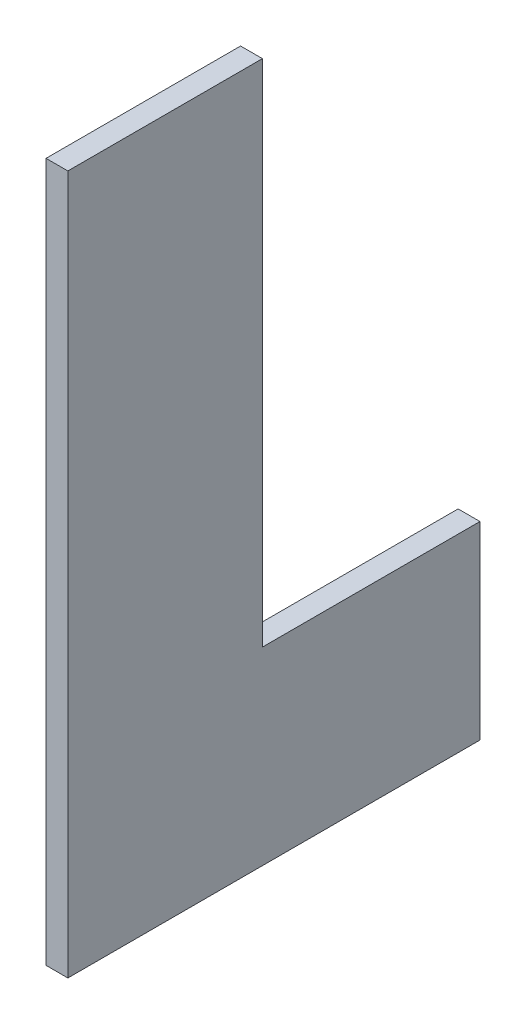
ISO-10303-21;
HEADER;
FILE_DESCRIPTION(('STEP AP214'),'2;1');
FILE_NAME('part.step','',(''),(''),'','','');
FILE_SCHEMA(('AUTOMOTIVE_DESIGN { 1 0 10303 214 1 1 1 1 }'));
ENDSEC;
DATA;
#1=APPLICATION_CONTEXT('core data for automotive mechanical design processes');
#2=APPLICATION_PROTOCOL_DEFINITION('international standard','automotive_design',2000,#1);
#3=PRODUCT_CONTEXT('',#1,'mechanical');
#4=PRODUCT('Part','Part','',(#3));
#5=PRODUCT_RELATED_PRODUCT_CATEGORY('part','',(#4));
#6=PRODUCT_DEFINITION_FORMATION('','',#4);
#7=PRODUCT_DEFINITION_CONTEXT('part definition',#1,'design');
#8=PRODUCT_DEFINITION('design','',#6,#7);
#9=PRODUCT_DEFINITION_SHAPE('','',#8);
#10=(LENGTH_UNIT() NAMED_UNIT(*) SI_UNIT(.MILLI.,.METRE.));
#11=(NAMED_UNIT(*) PLANE_ANGLE_UNIT() SI_UNIT($,.RADIAN.));
#12=(NAMED_UNIT(*) SI_UNIT($,.STERADIAN.) SOLID_ANGLE_UNIT());
#13=UNCERTAINTY_MEASURE_WITH_UNIT(LENGTH_MEASURE(1.E-05),#10,'distance_accuracy_value','');
#14=(GEOMETRIC_REPRESENTATION_CONTEXT(3) GLOBAL_UNCERTAINTY_ASSIGNED_CONTEXT((#13)) GLOBAL_UNIT_ASSIGNED_CONTEXT((#10,
#11,#12)) REPRESENTATION_CONTEXT('',''));
#15=CARTESIAN_POINT('',(0.,0.,0.));
#16=DIRECTION('',(0.,0.,1.));
#17=DIRECTION('',(1.,0.,0.));
#18=AXIS2_PLACEMENT_3D('',#15,#16,#17);
#19=CARTESIAN_POINT('',(19.05,-525.352237324474,-102.705829668172));
#20=DIRECTION('',(0.,1.,0.));
#21=DIRECTION('',(0.,0.,1.));
#22=AXIS2_PLACEMENT_3D('',#19,#20,#21);
#23=PLANE('',#22);
#24=DIRECTION('',(0.,0.,-1.));
#25=VECTOR('',#24,1.);
#26=CARTESIAN_POINT('',(0.,-525.352237324474,-102.705829668172));
#27=LINE('',#26,#25);
#28=CARTESIAN_POINT('',(0.,-525.352237324474,66.966170331828));
#29=VERTEX_POINT('',#28);
#30=CARTESIAN_POINT('',(0.,-525.352237324474,-292.443829668172));
#31=VERTEX_POINT('',#30);
#32=EDGE_CURVE('E86',#29,#31,#27,.T.);
#33=ORIENTED_EDGE('',*,*,#32,.T.);
#34=DIRECTION('',(-1.,0.,0.));
#35=VECTOR('',#34,1.);
#36=CARTESIAN_POINT('',(19.05,-525.352237324474,-292.443829668172));
#37=LINE('',#36,#35);
#38=CARTESIAN_POINT('',(19.05,-525.352237324474,-292.443829668172));
#39=VERTEX_POINT('',#38);
#40=EDGE_CURVE('E11',#39,#31,#37,.T.);
#41=ORIENTED_EDGE('',*,*,#40,.F.);
#42=DIRECTION('',(0.,0.,-1.));
#43=VECTOR('',#42,1.);
#44=CARTESIAN_POINT('',(19.05,-525.352237324474,66.966170331828));
#45=LINE('',#44,#43);
#46=CARTESIAN_POINT('',(19.05,-525.352237324474,66.966170331828));
#47=VERTEX_POINT('',#46);
#48=EDGE_CURVE('E92',#47,#39,#45,.T.);
#49=ORIENTED_EDGE('',*,*,#48,.F.);
#50=DIRECTION('',(-1.,0.,0.));
#51=VECTOR('',#50,1.);
#52=CARTESIAN_POINT('',(19.05,-525.352237324474,66.966170331828));
#53=LINE('',#52,#51);
#54=EDGE_CURVE('E124',#47,#29,#53,.T.);
#55=ORIENTED_EDGE('',*,*,#54,.T.);
#56=EDGE_LOOP('',(#33,#41,#49,#55));
#57=FACE_BOUND('',#56,.T.);
#58=ADVANCED_FACE('F39',(#57),#23,.F.);
#59=CARTESIAN_POINT('',(19.05,-525.352237324474,-292.443829668172));
#60=DIRECTION('',(0.,0.,1.));
#61=DIRECTION('',(0.,-1.,0.));
#62=AXIS2_PLACEMENT_3D('',#59,#60,#61);
#63=PLANE('',#62);
#64=DIRECTION('',(0.,1.,0.));
#65=VECTOR('',#64,1.);
#66=CARTESIAN_POINT('',(0.,-525.352237324474,-292.443829668172));
#67=LINE('',#66,#65);
#68=CARTESIAN_POINT('',(0.,-360.252237324474,-292.443829668172));
#69=VERTEX_POINT('',#68);
#70=EDGE_CURVE('E130',#31,#69,#67,.T.);
#71=ORIENTED_EDGE('',*,*,#70,.T.);
#72=DIRECTION('',(-1.,0.,0.));
#73=VECTOR('',#72,1.);
#74=CARTESIAN_POINT('',(19.05,-360.252237324474,-292.443829668172));
#75=LINE('',#74,#73);
#76=CARTESIAN_POINT('',(19.05,-360.252237324474,-292.443829668172));
#77=VERTEX_POINT('',#76);
#78=EDGE_CURVE('E48',#77,#69,#75,.T.);
#79=ORIENTED_EDGE('',*,*,#78,.F.);
#80=DIRECTION('',(0.,1.,0.));
#81=VECTOR('',#80,1.);
#82=CARTESIAN_POINT('',(19.05,-525.352237324474,-292.443829668172));
#83=LINE('',#82,#81);
#84=EDGE_CURVE('E162',#39,#77,#83,.T.);
#85=ORIENTED_EDGE('',*,*,#84,.F.);
#86=ORIENTED_EDGE('',*,*,#40,.T.);
#87=EDGE_LOOP('',(#71,#79,#85,#86));
#88=FACE_BOUND('',#87,.T.);
#89=ADVANCED_FACE('F167',(#88),#63,.F.);
#90=CARTESIAN_POINT('',(19.05,-360.252237324474,-292.443829668172));
#91=DIRECTION('',(0.,-1.,0.));
#92=DIRECTION('',(0.,0.,-1.));
#93=AXIS2_PLACEMENT_3D('',#90,#91,#92);
#94=PLANE('',#93);
#95=DIRECTION('',(0.,0.,1.));
#96=VECTOR('',#95,1.);
#97=CARTESIAN_POINT('',(0.,-360.252237324474,-292.443829668172));
#98=LINE('',#97,#96);
#99=CARTESIAN_POINT('',(0.,-360.252237324474,-102.705829668172));
#100=VERTEX_POINT('',#99);
#101=EDGE_CURVE('E133',#69,#100,#98,.T.);
#102=ORIENTED_EDGE('',*,*,#101,.T.);
#103=DIRECTION('',(-1.,0.,0.));
#104=VECTOR('',#103,1.);
#105=CARTESIAN_POINT('',(19.05,-360.252237324474,-102.705829668172));
#106=LINE('',#105,#104);
#107=CARTESIAN_POINT('',(19.05,-360.252237324474,-102.705829668172));
#108=VERTEX_POINT('',#107);
#109=EDGE_CURVE('E117',#108,#100,#106,.T.);
#110=ORIENTED_EDGE('',*,*,#109,.F.);
#111=DIRECTION('',(0.,0.,1.));
#112=VECTOR('',#111,1.);
#113=CARTESIAN_POINT('',(19.05,-360.252237324474,-292.443829668172));
#114=LINE('',#113,#112);
#115=EDGE_CURVE('E106',#77,#108,#114,.T.);
#116=ORIENTED_EDGE('',*,*,#115,.F.);
#117=ORIENTED_EDGE('',*,*,#78,.T.);
#118=EDGE_LOOP('',(#102,#110,#116,#117));
#119=FACE_BOUND('',#118,.T.);
#120=ADVANCED_FACE('F154',(#119),#94,.F.);
#121=CARTESIAN_POINT('',(19.05,-360.252237324474,-102.705829668172));
#122=DIRECTION('',(0.,0.,1.));
#123=DIRECTION('',(1.,0.,0.));
#124=AXIS2_PLACEMENT_3D('',#121,#122,#123);
#125=PLANE('',#124);
#126=DIRECTION('',(0.,1.,0.));
#127=VECTOR('',#126,1.);
#128=CARTESIAN_POINT('',(0.,-360.252237324474,-102.705829668172));
#129=LINE('',#128,#127);
#130=CARTESIAN_POINT('',(0.,84.2477626755256,-102.705829668172));
#131=VERTEX_POINT('',#130);
#132=EDGE_CURVE('E115',#100,#131,#129,.T.);
#133=ORIENTED_EDGE('',*,*,#132,.T.);
#134=DIRECTION('',(-1.,0.,0.));
#135=VECTOR('',#134,1.);
#136=CARTESIAN_POINT('',(19.05,84.2477626755256,-102.705829668172));
#137=LINE('',#136,#135);
#138=CARTESIAN_POINT('',(19.05,84.2477626755256,-102.705829668172));
#139=VERTEX_POINT('',#138);
#140=EDGE_CURVE('E112',#139,#131,#137,.T.);
#141=ORIENTED_EDGE('',*,*,#140,.F.);
#142=DIRECTION('',(0.,1.,0.));
#143=VECTOR('',#142,1.);
#144=CARTESIAN_POINT('',(19.05,-360.252237324474,-102.705829668172));
#145=LINE('',#144,#143);
#146=EDGE_CURVE('E100',#108,#139,#145,.T.);
#147=ORIENTED_EDGE('',*,*,#146,.F.);
#148=ORIENTED_EDGE('',*,*,#109,.T.);
#149=EDGE_LOOP('',(#133,#141,#147,#148));
#150=FACE_BOUND('',#149,.T.);
#151=ADVANCED_FACE('F113',(#150),#125,.F.);
#152=CARTESIAN_POINT('',(19.05,84.2477626755256,66.9661703318281));
#153=DIRECTION('',(0.,-1.,0.));
#154=DIRECTION('',(0.,0.,-1.));
#155=AXIS2_PLACEMENT_3D('',#152,#153,#154);
#156=PLANE('',#155);
#157=DIRECTION('',(0.,0.,1.));
#158=VECTOR('',#157,1.);
#159=CARTESIAN_POINT('',(0.,84.2477626755256,66.9661703318281));
#160=LINE('',#159,#158);
#161=CARTESIAN_POINT('',(0.,84.2477626755256,66.9661703318281));
#162=VERTEX_POINT('',#161);
#163=EDGE_CURVE('E79',#131,#162,#160,.T.);
#164=ORIENTED_EDGE('',*,*,#163,.T.);
#165=DIRECTION('',(-1.,0.,0.));
#166=VECTOR('',#165,1.);
#167=CARTESIAN_POINT('',(19.05,84.2477626755256,66.9661703318281));
#168=LINE('',#167,#166);
#169=CARTESIAN_POINT('',(19.05,84.2477626755256,66.9661703318281));
#170=VERTEX_POINT('',#169);
#171=EDGE_CURVE('E118',#170,#162,#168,.T.);
#172=ORIENTED_EDGE('',*,*,#171,.F.);
#173=DIRECTION('',(0.,0.,1.));
#174=VECTOR('',#173,1.);
#175=CARTESIAN_POINT('',(19.05,84.2477626755256,66.9661703318281));
#176=LINE('',#175,#174);
#177=EDGE_CURVE('E104',#139,#170,#176,.T.);
#178=ORIENTED_EDGE('',*,*,#177,.F.);
#179=ORIENTED_EDGE('',*,*,#140,.T.);
#180=EDGE_LOOP('',(#164,#172,#178,#179));
#181=FACE_BOUND('',#180,.T.);
#182=ADVANCED_FACE('F120',(#181),#156,.F.);
#183=CARTESIAN_POINT('',(19.05,84.2477626755256,66.9661703318281));
#184=DIRECTION('',(0.,0.,-1.));
#185=DIRECTION('',(0.,1.,0.));
#186=AXIS2_PLACEMENT_3D('',#183,#184,#185);
#187=PLANE('',#186);
#188=DIRECTION('',(0.,-1.,0.));
#189=VECTOR('',#188,1.);
#190=CARTESIAN_POINT('',(0.,84.2477626755256,66.9661703318281));
#191=LINE('',#190,#189);
#192=EDGE_CURVE('E140',#162,#29,#191,.T.);
#193=ORIENTED_EDGE('',*,*,#192,.T.);
#194=ORIENTED_EDGE('',*,*,#54,.F.);
#195=DIRECTION('',(0.,-1.,0.));
#196=VECTOR('',#195,1.);
#197=CARTESIAN_POINT('',(19.05,84.2477626755256,66.9661703318281));
#198=LINE('',#197,#196);
#199=EDGE_CURVE('E56',#170,#47,#198,.T.);
#200=ORIENTED_EDGE('',*,*,#199,.F.);
#201=ORIENTED_EDGE('',*,*,#171,.T.);
#202=EDGE_LOOP('',(#193,#194,#200,#201));
#203=FACE_BOUND('',#202,.T.);
#204=ADVANCED_FACE('F159',(#203),#187,.F.);
#205=CARTESIAN_POINT('',(19.05,0.,0.));
#206=DIRECTION('',(1.,0.,0.));
#207=DIRECTION('',(0.,0.,-1.));
#208=AXIS2_PLACEMENT_3D('',#205,#206,#207);
#209=PLANE('',#208);
#210=ORIENTED_EDGE('',*,*,#48,.T.);
#211=ORIENTED_EDGE('',*,*,#84,.T.);
#212=ORIENTED_EDGE('',*,*,#115,.T.);
#213=ORIENTED_EDGE('',*,*,#146,.T.);
#214=ORIENTED_EDGE('',*,*,#177,.T.);
#215=ORIENTED_EDGE('',*,*,#199,.T.);
#216=EDGE_LOOP('',(#210,#211,#212,#213,#214,#215));
#217=FACE_BOUND('',#216,.T.);
#218=ADVANCED_FACE('F102',(#217),#209,.T.);
#219=CARTESIAN_POINT('',(0.,0.,0.));
#220=DIRECTION('',(1.,0.,0.));
#221=DIRECTION('',(0.,0.,-1.));
#222=AXIS2_PLACEMENT_3D('',#219,#220,#221);
#223=PLANE('',#222);
#224=ORIENTED_EDGE('',*,*,#32,.F.);
#225=ORIENTED_EDGE('',*,*,#192,.F.);
#226=ORIENTED_EDGE('',*,*,#163,.F.);
#227=ORIENTED_EDGE('',*,*,#132,.F.);
#228=ORIENTED_EDGE('',*,*,#101,.F.);
#229=ORIENTED_EDGE('',*,*,#70,.F.);
#230=EDGE_LOOP('',(#224,#225,#226,#227,#228,#229));
#231=FACE_BOUND('',#230,.T.);
#232=ADVANCED_FACE('F157',(#231),#223,.F.);
#233=CLOSED_SHELL('',(#58,#89,#120,#151,#182,#204,#218,#232));
#234=MANIFOLD_SOLID_BREP('B2',#233);
#235=ADVANCED_BREP_SHAPE_REPRESENTATION('',(#18,#234),#14);
#236=SHAPE_DEFINITION_REPRESENTATION(#9,#235);
ENDSEC;
END-ISO-10303-21;
